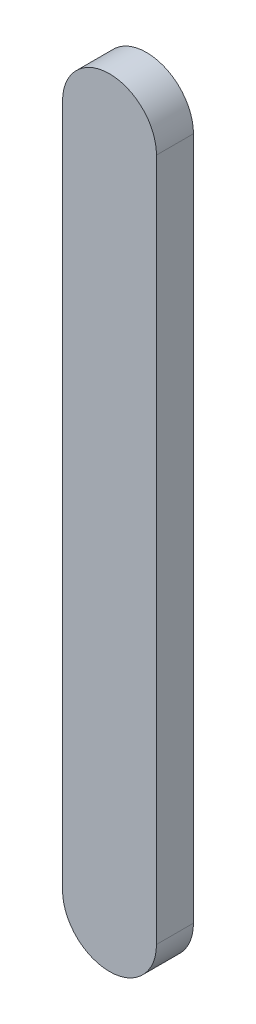
ISO-10303-21;
HEADER;
FILE_DESCRIPTION(('STEP AP214'),'2;1');
FILE_NAME('part.step','',(''),(''),'','','');
FILE_SCHEMA(('AUTOMOTIVE_DESIGN { 1 0 10303 214 1 1 1 1 }'));
ENDSEC;
DATA;
#1=APPLICATION_CONTEXT('core data for automotive mechanical design processes');
#2=APPLICATION_PROTOCOL_DEFINITION('international standard','automotive_design',2000,#1);
#3=PRODUCT_CONTEXT('',#1,'mechanical');
#4=PRODUCT('Part','Part','',(#3));
#5=PRODUCT_RELATED_PRODUCT_CATEGORY('part','',(#4));
#6=PRODUCT_DEFINITION_FORMATION('','',#4);
#7=PRODUCT_DEFINITION_CONTEXT('part definition',#1,'design');
#8=PRODUCT_DEFINITION('design','',#6,#7);
#9=PRODUCT_DEFINITION_SHAPE('','',#8);
#10=(LENGTH_UNIT() NAMED_UNIT(*) SI_UNIT(.MILLI.,.METRE.));
#11=(NAMED_UNIT(*) PLANE_ANGLE_UNIT() SI_UNIT($,.RADIAN.));
#12=(NAMED_UNIT(*) SI_UNIT($,.STERADIAN.) SOLID_ANGLE_UNIT());
#13=UNCERTAINTY_MEASURE_WITH_UNIT(LENGTH_MEASURE(1.E-05),#10,'distance_accuracy_value','');
#14=(GEOMETRIC_REPRESENTATION_CONTEXT(3) GLOBAL_UNCERTAINTY_ASSIGNED_CONTEXT((#13)) GLOBAL_UNIT_ASSIGNED_CONTEXT((#10,
#11,#12)) REPRESENTATION_CONTEXT('',''));
#15=CARTESIAN_POINT('',(0.,0.,0.));
#16=DIRECTION('',(0.,0.,1.));
#17=DIRECTION('',(1.,0.,0.));
#18=AXIS2_PLACEMENT_3D('',#15,#16,#17);
#19=CARTESIAN_POINT('',(109.22,115.3776712,0.));
#20=DIRECTION('',(-1.,0.,0.));
#21=DIRECTION('',(0.,1.,0.));
#22=AXIS2_PLACEMENT_3D('',#19,#20,#21);
#23=PLANE('',#22);
#24=DIRECTION('',(0.,1.,0.));
#25=VECTOR('',#24,1.);
#26=CARTESIAN_POINT('',(109.22,115.3776712,0.1999996));
#27=LINE('',#26,#25);
#28=CARTESIAN_POINT('',(109.22,115.3776712,0.1999996));
#29=VERTEX_POINT('',#28);
#30=CARTESIAN_POINT('',(109.22,119.0752,0.1999996));
#31=VERTEX_POINT('',#30);
#32=EDGE_CURVE('E11',#29,#31,#27,.T.);
#33=ORIENTED_EDGE('',*,*,#32,.F.);
#34=DIRECTION('',(0.,0.,1.));
#35=VECTOR('',#34,1.);
#36=CARTESIAN_POINT('',(109.22,115.3776712,0.));
#37=LINE('',#36,#35);
#38=CARTESIAN_POINT('',(109.22,115.3776712,0.));
#39=VERTEX_POINT('',#38);
#40=EDGE_CURVE('E24',#39,#29,#37,.T.);
#41=ORIENTED_EDGE('',*,*,#40,.F.);
#42=DIRECTION('',(0.,1.,0.));
#43=VECTOR('',#42,1.);
#44=CARTESIAN_POINT('',(109.22,115.3776712,0.));
#45=LINE('',#44,#43);
#46=CARTESIAN_POINT('',(109.22,119.0752,0.));
#47=VERTEX_POINT('',#46);
#48=EDGE_CURVE('E75',#39,#47,#45,.T.);
#49=ORIENTED_EDGE('',*,*,#48,.T.);
#50=DIRECTION('',(0.,0.,1.));
#51=VECTOR('',#50,1.);
#52=CARTESIAN_POINT('',(109.22,119.0752,0.));
#53=LINE('',#52,#51);
#54=EDGE_CURVE('E37',#47,#31,#53,.T.);
#55=ORIENTED_EDGE('',*,*,#54,.T.);
#56=EDGE_LOOP('',(#33,#41,#49,#55));
#57=FACE_BOUND('',#56,.T.);
#58=ADVANCED_FACE('F17',(#57),#23,.F.);
#59=CARTESIAN_POINT('',(108.966,119.0752,0.));
#60=DIRECTION('',(0.,0.,-1.));
#61=DIRECTION('',(1.,0.,0.));
#62=AXIS2_PLACEMENT_3D('',#59,#60,#61);
#63=CYLINDRICAL_SURFACE('',#62,0.253999999999995);
#64=CARTESIAN_POINT('',(108.966,119.0752,0.1999996));
#65=DIRECTION('',(0.,0.,1.));
#66=DIRECTION('',(1.,0.,0.));
#67=AXIS2_PLACEMENT_3D('',#64,#65,#66);
#68=CIRCLE('',#67,0.253999999999995);
#69=CARTESIAN_POINT('',(108.712,119.0752,0.1999996));
#70=VERTEX_POINT('',#69);
#71=EDGE_CURVE('E83',#31,#70,#68,.T.);
#72=ORIENTED_EDGE('',*,*,#71,.F.);
#73=ORIENTED_EDGE('',*,*,#54,.F.);
#74=CARTESIAN_POINT('',(108.966,119.0752,0.));
#75=DIRECTION('',(0.,0.,1.));
#76=DIRECTION('',(1.,0.,0.));
#77=AXIS2_PLACEMENT_3D('',#74,#75,#76);
#78=CIRCLE('',#77,0.253999999999995);
#79=CARTESIAN_POINT('',(108.712,119.0752,0.));
#80=VERTEX_POINT('',#79);
#81=EDGE_CURVE('E81',#47,#80,#78,.T.);
#82=ORIENTED_EDGE('',*,*,#81,.T.);
#83=DIRECTION('',(0.,0.,1.));
#84=VECTOR('',#83,1.);
#85=CARTESIAN_POINT('',(108.712,119.0752,0.));
#86=LINE('',#85,#84);
#87=EDGE_CURVE('E67',#80,#70,#86,.T.);
#88=ORIENTED_EDGE('',*,*,#87,.T.);
#89=EDGE_LOOP('',(#72,#73,#82,#88));
#90=FACE_BOUND('',#89,.T.);
#91=ADVANCED_FACE('F89',(#90),#63,.T.);
#92=CARTESIAN_POINT('',(108.712,119.0752,0.));
#93=DIRECTION('',(1.,0.,0.));
#94=DIRECTION('',(0.,-1.,0.));
#95=AXIS2_PLACEMENT_3D('',#92,#93,#94);
#96=PLANE('',#95);
#97=DIRECTION('',(0.,-1.,0.));
#98=VECTOR('',#97,1.);
#99=CARTESIAN_POINT('',(108.712,119.0752,0.1999996));
#100=LINE('',#99,#98);
#101=CARTESIAN_POINT('',(108.712,115.3776712,0.1999996));
#102=VERTEX_POINT('',#101);
#103=EDGE_CURVE('E71',#70,#102,#100,.T.);
#104=ORIENTED_EDGE('',*,*,#103,.F.);
#105=ORIENTED_EDGE('',*,*,#87,.F.);
#106=DIRECTION('',(0.,-1.,0.));
#107=VECTOR('',#106,1.);
#108=CARTESIAN_POINT('',(108.712,119.0752,0.));
#109=LINE('',#108,#107);
#110=CARTESIAN_POINT('',(108.712,115.3776712,0.));
#111=VERTEX_POINT('',#110);
#112=EDGE_CURVE('E63',#80,#111,#109,.T.);
#113=ORIENTED_EDGE('',*,*,#112,.T.);
#114=DIRECTION('',(0.,0.,1.));
#115=VECTOR('',#114,1.);
#116=CARTESIAN_POINT('',(108.712,115.3776712,0.));
#117=LINE('',#116,#115);
#118=EDGE_CURVE('E53',#111,#102,#117,.T.);
#119=ORIENTED_EDGE('',*,*,#118,.T.);
#120=EDGE_LOOP('',(#104,#105,#113,#119));
#121=FACE_BOUND('',#120,.T.);
#122=ADVANCED_FACE('F66',(#121),#96,.F.);
#123=CARTESIAN_POINT('',(108.966,115.3776712,0.));
#124=DIRECTION('',(0.,0.,-1.));
#125=DIRECTION('',(-1.,0.,0.));
#126=AXIS2_PLACEMENT_3D('',#123,#124,#125);
#127=CYLINDRICAL_SURFACE('',#126,0.253999999999995);
#128=CARTESIAN_POINT('',(108.966,115.3776712,0.1999996));
#129=DIRECTION('',(0.,0.,1.));
#130=DIRECTION('',(-1.,0.,0.));
#131=AXIS2_PLACEMENT_3D('',#128,#129,#130);
#132=CIRCLE('',#131,0.253999999999995);
#133=EDGE_CURVE('E59',#102,#29,#132,.T.);
#134=ORIENTED_EDGE('',*,*,#133,.F.);
#135=ORIENTED_EDGE('',*,*,#118,.F.);
#136=CARTESIAN_POINT('',(108.966,115.3776712,0.));
#137=DIRECTION('',(0.,0.,1.));
#138=DIRECTION('',(-1.,0.,0.));
#139=AXIS2_PLACEMENT_3D('',#136,#137,#138);
#140=CIRCLE('',#139,0.253999999999995);
#141=EDGE_CURVE('E57',#111,#39,#140,.T.);
#142=ORIENTED_EDGE('',*,*,#141,.T.);
#143=ORIENTED_EDGE('',*,*,#40,.T.);
#144=EDGE_LOOP('',(#134,#135,#142,#143));
#145=FACE_BOUND('',#144,.T.);
#146=ADVANCED_FACE('F55',(#145),#127,.T.);
#147=CARTESIAN_POINT('',(109.22,115.3776712,0.));
#148=DIRECTION('',(0.,0.,-1.));
#149=DIRECTION('',(-1.,0.,0.));
#150=AXIS2_PLACEMENT_3D('',#147,#148,#149);
#151=PLANE('',#150);
#152=ORIENTED_EDGE('',*,*,#141,.F.);
#153=ORIENTED_EDGE('',*,*,#112,.F.);
#154=ORIENTED_EDGE('',*,*,#81,.F.);
#155=ORIENTED_EDGE('',*,*,#48,.F.);
#156=EDGE_LOOP('',(#152,#153,#154,#155));
#157=FACE_BOUND('',#156,.T.);
#158=ADVANCED_FACE('F74',(#157),#151,.T.);
#159=CARTESIAN_POINT('',(109.22,115.3776712,0.1999996));
#160=DIRECTION('',(0.,0.,-1.));
#161=DIRECTION('',(-1.,0.,0.));
#162=AXIS2_PLACEMENT_3D('',#159,#160,#161);
#163=PLANE('',#162);
#164=ORIENTED_EDGE('',*,*,#32,.T.);
#165=ORIENTED_EDGE('',*,*,#71,.T.);
#166=ORIENTED_EDGE('',*,*,#103,.T.);
#167=ORIENTED_EDGE('',*,*,#133,.T.);
#168=EDGE_LOOP('',(#164,#165,#166,#167));
#169=FACE_BOUND('',#168,.T.);
#170=ADVANCED_FACE('F91',(#169),#163,.F.);
#171=CLOSED_SHELL('',(#58,#91,#122,#146,#158,#170));
#172=MANIFOLD_SOLID_BREP('B1',#171);
#173=ADVANCED_BREP_SHAPE_REPRESENTATION('',(#18,#172),#14);
#174=SHAPE_DEFINITION_REPRESENTATION(#9,#173);
ENDSEC;
END-ISO-10303-21;
